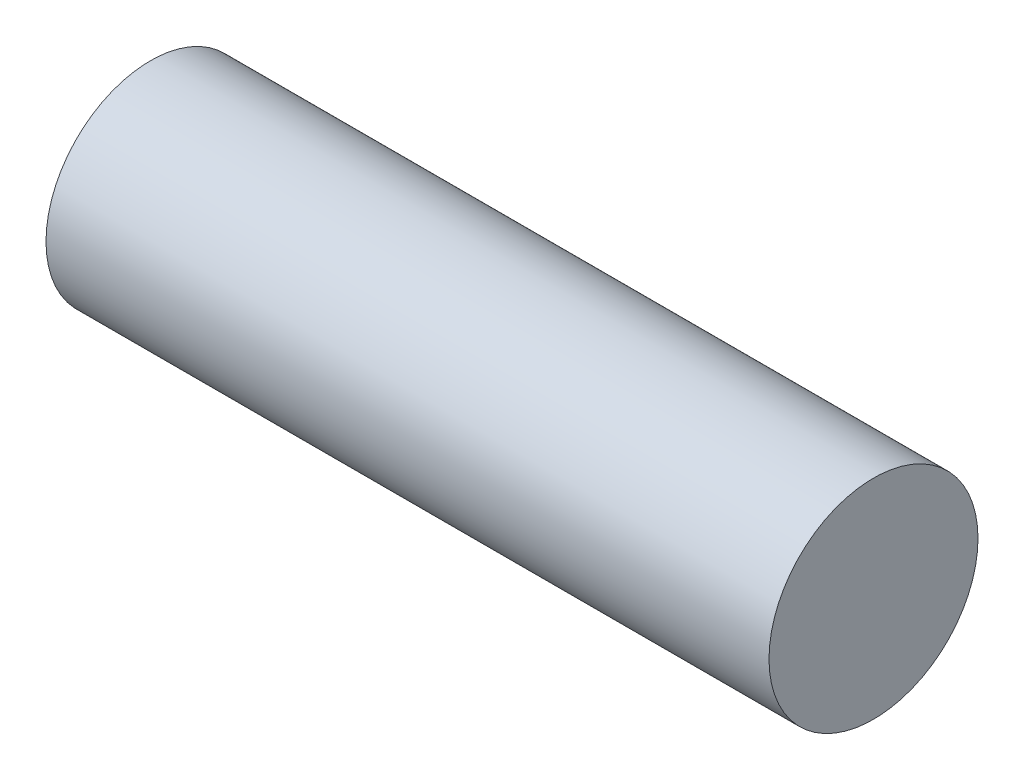
ISO-10303-21;
HEADER;
FILE_DESCRIPTION(('STEP AP214'),'2;1');
FILE_NAME('part.step','',(''),(''),'','','');
FILE_SCHEMA(('AUTOMOTIVE_DESIGN { 1 0 10303 214 1 1 1 1 }'));
ENDSEC;
DATA;
#1=APPLICATION_CONTEXT('core data for automotive mechanical design processes');
#2=APPLICATION_PROTOCOL_DEFINITION('international standard','automotive_design',2000,#1);
#3=PRODUCT_CONTEXT('',#1,'mechanical');
#4=PRODUCT('Part','Part','',(#3));
#5=PRODUCT_RELATED_PRODUCT_CATEGORY('part','',(#4));
#6=PRODUCT_DEFINITION_FORMATION('','',#4);
#7=PRODUCT_DEFINITION_CONTEXT('part definition',#1,'design');
#8=PRODUCT_DEFINITION('design','',#6,#7);
#9=PRODUCT_DEFINITION_SHAPE('','',#8);
#10=(LENGTH_UNIT() NAMED_UNIT(*) SI_UNIT(.MILLI.,.METRE.));
#11=(NAMED_UNIT(*) PLANE_ANGLE_UNIT() SI_UNIT($,.RADIAN.));
#12=(NAMED_UNIT(*) SI_UNIT($,.STERADIAN.) SOLID_ANGLE_UNIT());
#13=UNCERTAINTY_MEASURE_WITH_UNIT(LENGTH_MEASURE(1.E-05),#10,'distance_accuracy_value','');
#14=(GEOMETRIC_REPRESENTATION_CONTEXT(3) GLOBAL_UNCERTAINTY_ASSIGNED_CONTEXT((#13)) GLOBAL_UNIT_ASSIGNED_CONTEXT((#10,
#11,#12)) REPRESENTATION_CONTEXT('',''));
#15=CARTESIAN_POINT('',(0.,0.,0.));
#16=DIRECTION('',(0.,0.,1.));
#17=DIRECTION('',(1.,0.,0.));
#18=AXIS2_PLACEMENT_3D('',#15,#16,#17);
#19=CARTESIAN_POINT('',(-9.15590551181102,1.72,0.));
#20=DIRECTION('',(1.,0.,0.));
#21=DIRECTION('',(0.,0.,-1.));
#22=AXIS2_PLACEMENT_3D('',#19,#20,#21);
#23=PLANE('',#22);
#24=CARTESIAN_POINT('',(-9.15590551181102,0.,0.));
#25=DIRECTION('',(-1.,0.,0.));
#26=DIRECTION('',(0.,0.,1.));
#27=AXIS2_PLACEMENT_3D('',#24,#25,#26);
#28=CIRCLE('',#27,1.72);
#29=CARTESIAN_POINT('',(-9.15590551181102,0.,1.72));
#30=VERTEX_POINT('',#29);
#31=EDGE_CURVE('E43',#30,#30,#28,.T.);
#32=ORIENTED_EDGE('',*,*,#31,.T.);
#33=EDGE_LOOP('',(#32));
#34=FACE_BOUND('',#33,.T.);
#35=ADVANCED_FACE('F37',(#34),#23,.F.);
#36=CARTESIAN_POINT('',(2.74409448818898,0.,0.));
#37=DIRECTION('',(-1.,0.,0.));
#38=DIRECTION('',(0.,0.,1.));
#39=AXIS2_PLACEMENT_3D('',#36,#37,#38);
#40=PLANE('',#39);
#41=CARTESIAN_POINT('',(2.74409448818898,0.,0.));
#42=DIRECTION('',(-1.,0.,0.));
#43=DIRECTION('',(0.,0.,1.));
#44=AXIS2_PLACEMENT_3D('',#41,#42,#43);
#45=CIRCLE('',#44,1.72);
#46=CARTESIAN_POINT('',(2.74409448818898,0.,1.72));
#47=VERTEX_POINT('',#46);
#48=EDGE_CURVE('E10',#47,#47,#45,.T.);
#49=ORIENTED_EDGE('',*,*,#48,.F.);
#50=EDGE_LOOP('',(#49));
#51=FACE_BOUND('',#50,.T.);
#52=ADVANCED_FACE('F52',(#51),#40,.F.);
#53=CARTESIAN_POINT('',(-9.15590551181102,0.,0.));
#54=DIRECTION('',(-1.,0.,0.));
#55=DIRECTION('',(0.,0.,1.));
#56=AXIS2_PLACEMENT_3D('',#53,#54,#55);
#57=CYLINDRICAL_SURFACE('',#56,1.72);
#58=ORIENTED_EDGE('',*,*,#31,.F.);
#59=EDGE_LOOP('',(#58));
#60=FACE_BOUND('',#59,.T.);
#61=ORIENTED_EDGE('',*,*,#48,.T.);
#62=EDGE_LOOP('',(#61));
#63=FACE_BOUND('',#62,.T.);
#64=ADVANCED_FACE('F50',(#60,#63),#57,.T.);
#65=CLOSED_SHELL('',(#35,#52,#64));
#66=MANIFOLD_SOLID_BREP('B2',#65);
#67=ADVANCED_BREP_SHAPE_REPRESENTATION('',(#18,#66),#14);
#68=SHAPE_DEFINITION_REPRESENTATION(#9,#67);
ENDSEC;
END-ISO-10303-21;
